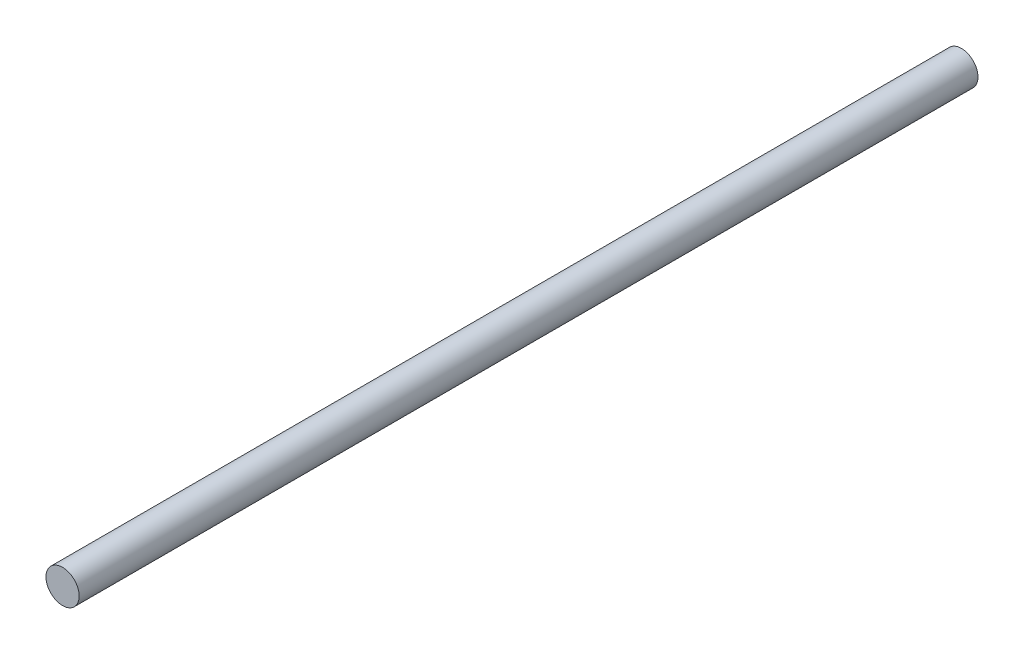
ISO-10303-21;
HEADER;
FILE_DESCRIPTION(('STEP AP214'),'2;1');
FILE_NAME('part.step','',(''),(''),'','','');
FILE_SCHEMA(('AUTOMOTIVE_DESIGN { 1 0 10303 214 1 1 1 1 }'));
ENDSEC;
DATA;
#1=APPLICATION_CONTEXT('core data for automotive mechanical design processes');
#2=APPLICATION_PROTOCOL_DEFINITION('international standard','automotive_design',2000,#1);
#3=PRODUCT_CONTEXT('',#1,'mechanical');
#4=PRODUCT('Part','Part','',(#3));
#5=PRODUCT_RELATED_PRODUCT_CATEGORY('part','',(#4));
#6=PRODUCT_DEFINITION_FORMATION('','',#4);
#7=PRODUCT_DEFINITION_CONTEXT('part definition',#1,'design');
#8=PRODUCT_DEFINITION('design','',#6,#7);
#9=PRODUCT_DEFINITION_SHAPE('','',#8);
#10=(LENGTH_UNIT() NAMED_UNIT(*) SI_UNIT(.MILLI.,.METRE.));
#11=(NAMED_UNIT(*) PLANE_ANGLE_UNIT() SI_UNIT($,.RADIAN.));
#12=(NAMED_UNIT(*) SI_UNIT($,.STERADIAN.) SOLID_ANGLE_UNIT());
#13=UNCERTAINTY_MEASURE_WITH_UNIT(LENGTH_MEASURE(1.E-05),#10,'distance_accuracy_value','');
#14=(GEOMETRIC_REPRESENTATION_CONTEXT(3) GLOBAL_UNCERTAINTY_ASSIGNED_CONTEXT((#13)) GLOBAL_UNIT_ASSIGNED_CONTEXT((#10,
#11,#12)) REPRESENTATION_CONTEXT('',''));
#15=CARTESIAN_POINT('',(0.,0.,0.));
#16=DIRECTION('',(0.,0.,1.));
#17=DIRECTION('',(1.,0.,0.));
#18=AXIS2_PLACEMENT_3D('',#15,#16,#17);
#19=CARTESIAN_POINT('',(0.,0.,325.00062));
#20=DIRECTION('',(0.,0.,-1.));
#21=DIRECTION('',(-1.,0.,0.));
#22=AXIS2_PLACEMENT_3D('',#19,#20,#21);
#23=CYLINDRICAL_SURFACE('',#22,5.99948);
#24=CARTESIAN_POINT('',(0.,0.,325.00062));
#25=DIRECTION('',(0.,0.,1.));
#26=DIRECTION('',(1.,0.,0.));
#27=AXIS2_PLACEMENT_3D('',#24,#25,#26);
#28=CIRCLE('',#27,5.99948);
#29=CARTESIAN_POINT('',(5.99948,0.,325.00062));
#30=VERTEX_POINT('',#29);
#31=EDGE_CURVE('E10',#30,#30,#28,.T.);
#32=ORIENTED_EDGE('',*,*,#31,.F.);
#33=EDGE_LOOP('',(#32));
#34=FACE_BOUND('',#33,.T.);
#35=CARTESIAN_POINT('',(0.,0.,0.));
#36=DIRECTION('',(0.,0.,1.));
#37=DIRECTION('',(1.,0.,0.));
#38=AXIS2_PLACEMENT_3D('',#35,#36,#37);
#39=CIRCLE('',#38,5.99948);
#40=CARTESIAN_POINT('',(5.99948,0.,0.));
#41=VERTEX_POINT('',#40);
#42=EDGE_CURVE('E40',#41,#41,#39,.T.);
#43=ORIENTED_EDGE('',*,*,#42,.T.);
#44=EDGE_LOOP('',(#43));
#45=FACE_BOUND('',#44,.T.);
#46=ADVANCED_FACE('F37',(#34,#45),#23,.T.);
#47=CARTESIAN_POINT('',(0.,0.,325.00062));
#48=DIRECTION('',(0.,0.,1.));
#49=DIRECTION('',(1.,0.,0.));
#50=AXIS2_PLACEMENT_3D('',#47,#48,#49);
#51=PLANE('',#50);
#52=ORIENTED_EDGE('',*,*,#31,.T.);
#53=EDGE_LOOP('',(#52));
#54=FACE_BOUND('',#53,.T.);
#55=ADVANCED_FACE('F54',(#54),#51,.T.);
#56=CARTESIAN_POINT('',(0.,0.,0.));
#57=DIRECTION('',(0.,0.,1.));
#58=DIRECTION('',(1.,0.,0.));
#59=AXIS2_PLACEMENT_3D('',#56,#57,#58);
#60=PLANE('',#59);
#61=ORIENTED_EDGE('',*,*,#42,.F.);
#62=EDGE_LOOP('',(#61));
#63=FACE_BOUND('',#62,.T.);
#64=ADVANCED_FACE('F52',(#63),#60,.F.);
#65=CLOSED_SHELL('',(#46,#55,#64));
#66=MANIFOLD_SOLID_BREP('B2',#65);
#67=ADVANCED_BREP_SHAPE_REPRESENTATION('',(#18,#66),#14);
#68=SHAPE_DEFINITION_REPRESENTATION(#9,#67);
ENDSEC;
END-ISO-10303-21;
